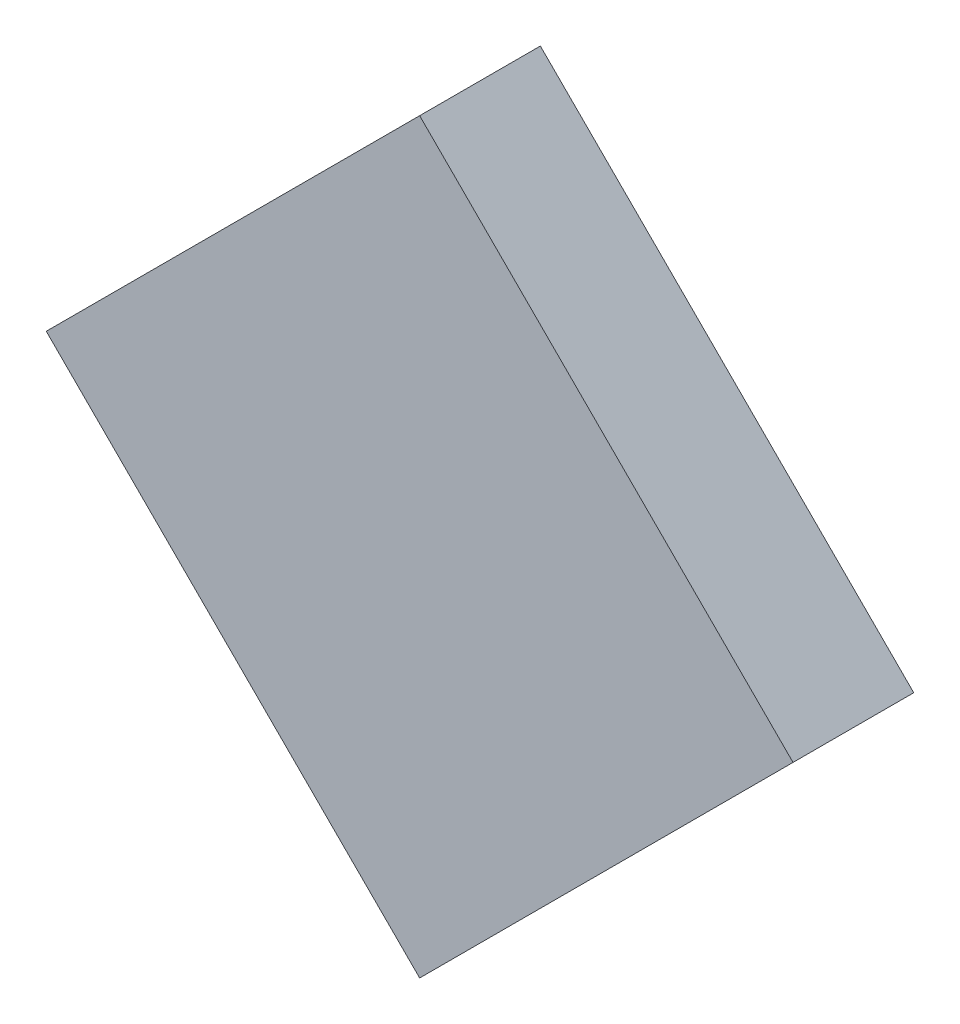
ISO-10303-21;
HEADER;
FILE_DESCRIPTION(('STEP AP214'),'2;1');
FILE_NAME('part.step','',(''),(''),'','','');
FILE_SCHEMA(('AUTOMOTIVE_DESIGN { 1 0 10303 214 1 1 1 1 }'));
ENDSEC;
DATA;
#1=APPLICATION_CONTEXT('core data for automotive mechanical design processes');
#2=APPLICATION_PROTOCOL_DEFINITION('international standard','automotive_design',2000,#1);
#3=PRODUCT_CONTEXT('',#1,'mechanical');
#4=PRODUCT('Part','Part','',(#3));
#5=PRODUCT_RELATED_PRODUCT_CATEGORY('part','',(#4));
#6=PRODUCT_DEFINITION_FORMATION('','',#4);
#7=PRODUCT_DEFINITION_CONTEXT('part definition',#1,'design');
#8=PRODUCT_DEFINITION('design','',#6,#7);
#9=PRODUCT_DEFINITION_SHAPE('','',#8);
#10=(LENGTH_UNIT() NAMED_UNIT(*) SI_UNIT(.MILLI.,.METRE.));
#11=(NAMED_UNIT(*) PLANE_ANGLE_UNIT() SI_UNIT($,.RADIAN.));
#12=(NAMED_UNIT(*) SI_UNIT($,.STERADIAN.) SOLID_ANGLE_UNIT());
#13=UNCERTAINTY_MEASURE_WITH_UNIT(LENGTH_MEASURE(1.E-05),#10,'distance_accuracy_value','');
#14=(GEOMETRIC_REPRESENTATION_CONTEXT(3) GLOBAL_UNCERTAINTY_ASSIGNED_CONTEXT((#13)) GLOBAL_UNIT_ASSIGNED_CONTEXT((#10,
#11,#12)) REPRESENTATION_CONTEXT('',''));
#15=CARTESIAN_POINT('',(0.,0.,0.));
#16=DIRECTION('',(0.,0.,1.));
#17=DIRECTION('',(1.,0.,0.));
#18=AXIS2_PLACEMENT_3D('',#15,#16,#17);
#19=CARTESIAN_POINT('',(-2.539999996998E-06,4.94974626,1.59999934));
#20=DIRECTION('',(0.,0.,1.));
#21=DIRECTION('',(1.,0.,0.));
#22=AXIS2_PLACEMENT_3D('',#19,#20,#21);
#23=PLANE('',#22);
#24=DIRECTION('',(0.707106599758024,0.707106962615024,0.));
#25=VECTOR('',#24,1.);
#26=CARTESIAN_POINT('',(4.94974372,2.539999996998E-06,1.59999934));
#27=LINE('',#26,#25);
#28=CARTESIAN_POINT('',(4.94974371999972,2.53999971375648E-06,1.59999934));
#29=VERTEX_POINT('',#28);
#30=CARTESIAN_POINT('',(-2.54000011786468E-06,-4.94974625999988,1.59999934));
#31=VERTEX_POINT('',#30);
#32=EDGE_CURVE('E52',#29,#31,#27,.F.);
#33=ORIENTED_EDGE('',*,*,#32,.F.);
#34=DIRECTION('',(-0.707106962615024,0.707106599758024,0.));
#35=VECTOR('',#34,1.);
#36=CARTESIAN_POINT('',(-2.539999996998E-06,4.94974626,1.59999934));
#37=LINE('',#36,#35);
#38=CARTESIAN_POINT('',(-2.53999910304904E-06,4.94974625999911,1.59999934));
#39=VERTEX_POINT('',#38);
#40=EDGE_CURVE('E67',#39,#29,#37,.F.);
#41=ORIENTED_EDGE('',*,*,#40,.F.);
#42=DIRECTION('',(-0.707106599758024,-0.707106962615024,0.));
#43=VECTOR('',#42,1.);
#44=CARTESIAN_POINT('',(-4.94974372,2.539999996998E-06,1.59999934));
#45=LINE('',#44,#43);
#46=CARTESIAN_POINT('',(-4.94974371999998,2.54000002091095E-06,1.59999934));
#47=VERTEX_POINT('',#46);
#48=EDGE_CURVE('E19',#47,#39,#45,.F.);
#49=ORIENTED_EDGE('',*,*,#48,.F.);
#50=DIRECTION('',(0.707106236900338,-0.707107325472338,0.));
#51=VECTOR('',#50,1.);
#52=CARTESIAN_POINT('',(-2.539999996998E-06,-4.94974626,1.59999934));
#53=LINE('',#52,#51);
#54=EDGE_CURVE('E57',#31,#47,#53,.F.);
#55=ORIENTED_EDGE('',*,*,#54,.F.);
#56=EDGE_LOOP('',(#33,#41,#49,#55));
#57=FACE_BOUND('',#56,.T.);
#58=ADVANCED_FACE('F16',(#57),#23,.T.);
#59=CARTESIAN_POINT('',(-4.94974372,2.539999996998E-06,0.));
#60=DIRECTION('',(-0.707106962615024,0.707106599758024,0.));
#61=DIRECTION('',(-0.707106599758024,-0.707106962615024,0.));
#62=AXIS2_PLACEMENT_3D('',#59,#60,#61);
#63=PLANE('',#62);
#64=DIRECTION('',(0.,0.,1.));
#65=VECTOR('',#64,1.);
#66=CARTESIAN_POINT('',(-2.539999996998E-06,4.94974626,0.));
#67=LINE('',#66,#65);
#68=CARTESIAN_POINT('',(-2.53999910239852E-06,4.94974625999911,0.));
#69=VERTEX_POINT('',#68);
#70=EDGE_CURVE('E78',#69,#39,#67,.T.);
#71=ORIENTED_EDGE('',*,*,#70,.F.);
#72=DIRECTION('',(-0.707106599757769,-0.70710696261528,0.));
#73=VECTOR('',#72,1.);
#74=CARTESIAN_POINT('',(-2.539999996998E-06,4.94974626,0.));
#75=LINE('',#74,#73);
#76=CARTESIAN_POINT('',(-4.94974371999998,2.54000002139675E-06,0.));
#77=VERTEX_POINT('',#76);
#78=EDGE_CURVE('E73',#69,#77,#75,.T.);
#79=ORIENTED_EDGE('',*,*,#78,.T.);
#80=DIRECTION('',(0.,0.,1.));
#81=VECTOR('',#80,1.);
#82=CARTESIAN_POINT('',(-4.94974371999991,2.54000009393407E-06,0.));
#83=LINE('',#82,#81);
#84=EDGE_CURVE('E62',#47,#77,#83,.F.);
#85=ORIENTED_EDGE('',*,*,#84,.F.);
#86=ORIENTED_EDGE('',*,*,#48,.T.);
#87=EDGE_LOOP('',(#71,#79,#85,#86));
#88=FACE_BOUND('',#87,.T.);
#89=ADVANCED_FACE('F72',(#88),#63,.T.);
#90=CARTESIAN_POINT('',(-2.539999996998E-06,-4.94974626,0.));
#91=DIRECTION('',(-0.707107325472338,-0.707106236900338,0.));
#92=DIRECTION('',(0.707106236900338,-0.707107325472338,0.));
#93=AXIS2_PLACEMENT_3D('',#90,#91,#92);
#94=PLANE('',#93);
#95=ORIENTED_EDGE('',*,*,#84,.T.);
#96=DIRECTION('',(0.707106236900352,-0.707107325472324,0.));
#97=VECTOR('',#96,1.);
#98=CARTESIAN_POINT('',(-4.94974372,2.53999999678955E-06,0.));
#99=LINE('',#98,#97);
#100=CARTESIAN_POINT('',(-2.54000011833745E-06,-4.94974625999988,0.));
#101=VERTEX_POINT('',#100);
#102=EDGE_CURVE('E83',#77,#101,#99,.T.);
#103=ORIENTED_EDGE('',*,*,#102,.T.);
#104=DIRECTION('',(0.,0.,1.));
#105=VECTOR('',#104,1.);
#106=CARTESIAN_POINT('',(-2.54000048251213E-06,-4.94974625999952,0.));
#107=LINE('',#106,#105);
#108=EDGE_CURVE('E64',#31,#101,#107,.F.);
#109=ORIENTED_EDGE('',*,*,#108,.F.);
#110=ORIENTED_EDGE('',*,*,#54,.T.);
#111=EDGE_LOOP('',(#95,#103,#109,#110));
#112=FACE_BOUND('',#111,.T.);
#113=ADVANCED_FACE('F59',(#112),#94,.T.);
#114=CARTESIAN_POINT('',(4.94974372,2.539999996998E-06,0.));
#115=DIRECTION('',(0.707106962615024,-0.707106599758024,0.));
#116=DIRECTION('',(0.707106599758024,0.707106962615024,0.));
#117=AXIS2_PLACEMENT_3D('',#114,#115,#116);
#118=PLANE('',#117);
#119=ORIENTED_EDGE('',*,*,#108,.T.);
#120=DIRECTION('',(0.707106599757955,0.707106962615093,0.));
#121=VECTOR('',#120,1.);
#122=CARTESIAN_POINT('',(-2.539999996998E-06,-4.94974626,0.));
#123=LINE('',#122,#121);
#124=CARTESIAN_POINT('',(4.94974371999972,2.53999971342912E-06,0.));
#125=VERTEX_POINT('',#124);
#126=EDGE_CURVE('E25',#101,#125,#123,.T.);
#127=ORIENTED_EDGE('',*,*,#126,.T.);
#128=DIRECTION('',(0.,0.,1.));
#129=VECTOR('',#128,1.);
#130=CARTESIAN_POINT('',(4.94974371999887,2.53999886314776E-06,0.));
#131=LINE('',#130,#129);
#132=EDGE_CURVE('E33',#29,#125,#131,.F.);
#133=ORIENTED_EDGE('',*,*,#132,.F.);
#134=ORIENTED_EDGE('',*,*,#32,.T.);
#135=EDGE_LOOP('',(#119,#127,#133,#134));
#136=FACE_BOUND('',#135,.T.);
#137=ADVANCED_FACE('F87',(#136),#118,.T.);
#138=CARTESIAN_POINT('',(-2.539999996998E-06,4.94974626,0.));
#139=DIRECTION('',(0.707106599758024,0.707106962615024,0.));
#140=DIRECTION('',(-0.707106962615024,0.707106599758024,0.));
#141=AXIS2_PLACEMENT_3D('',#138,#139,#140);
#142=PLANE('',#141);
#143=ORIENTED_EDGE('',*,*,#132,.T.);
#144=DIRECTION('',(-0.707106962615186,0.707106599757862,0.));
#145=VECTOR('',#144,1.);
#146=CARTESIAN_POINT('',(4.94974372,2.53999999678955E-06,0.));
#147=LINE('',#146,#145);
#148=EDGE_CURVE('E11',#125,#69,#147,.T.);
#149=ORIENTED_EDGE('',*,*,#148,.T.);
#150=ORIENTED_EDGE('',*,*,#70,.T.);
#151=ORIENTED_EDGE('',*,*,#40,.T.);
#152=EDGE_LOOP('',(#143,#149,#150,#151));
#153=FACE_BOUND('',#152,.T.);
#154=ADVANCED_FACE('F90',(#153),#142,.T.);
#155=CARTESIAN_POINT('',(-2.539999996998E-06,4.94974626,0.));
#156=DIRECTION('',(0.,0.,1.));
#157=DIRECTION('',(1.,0.,0.));
#158=AXIS2_PLACEMENT_3D('',#155,#156,#157);
#159=PLANE('',#158);
#160=ORIENTED_EDGE('',*,*,#126,.F.);
#161=ORIENTED_EDGE('',*,*,#102,.F.);
#162=ORIENTED_EDGE('',*,*,#78,.F.);
#163=ORIENTED_EDGE('',*,*,#148,.F.);
#164=EDGE_LOOP('',(#160,#161,#162,#163));
#165=FACE_BOUND('',#164,.T.);
#166=ADVANCED_FACE('F89',(#165),#159,.F.);
#167=CLOSED_SHELL('',(#58,#89,#113,#137,#154,#166));
#168=MANIFOLD_SOLID_BREP('B1',#167);
#169=ADVANCED_BREP_SHAPE_REPRESENTATION('',(#18,#168),#14);
#170=SHAPE_DEFINITION_REPRESENTATION(#9,#169);
ENDSEC;
END-ISO-10303-21;
